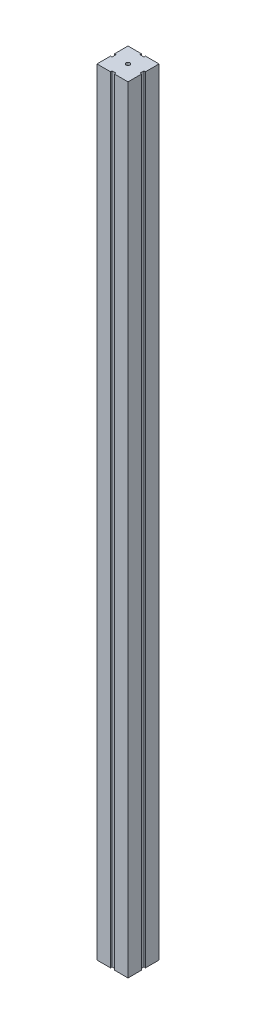
ISO-10303-21;
HEADER;
FILE_DESCRIPTION(('STEP AP214'),'2;1');
FILE_NAME('part.step','',(''),(''),'','','');
FILE_SCHEMA(('AUTOMOTIVE_DESIGN { 1 0 10303 214 1 1 1 1 }'));
ENDSEC;
DATA;
#1=APPLICATION_CONTEXT('core data for automotive mechanical design processes');
#2=APPLICATION_PROTOCOL_DEFINITION('international standard','automotive_design',2000,#1);
#3=PRODUCT_CONTEXT('',#1,'mechanical');
#4=PRODUCT('Part','Part','',(#3));
#5=PRODUCT_RELATED_PRODUCT_CATEGORY('part','',(#4));
#6=PRODUCT_DEFINITION_FORMATION('','',#4);
#7=PRODUCT_DEFINITION_CONTEXT('part definition',#1,'design');
#8=PRODUCT_DEFINITION('design','',#6,#7);
#9=PRODUCT_DEFINITION_SHAPE('','',#8);
#10=(LENGTH_UNIT() NAMED_UNIT(*) SI_UNIT(.MILLI.,.METRE.));
#11=(NAMED_UNIT(*) PLANE_ANGLE_UNIT() SI_UNIT($,.RADIAN.));
#12=(NAMED_UNIT(*) SI_UNIT($,.STERADIAN.) SOLID_ANGLE_UNIT());
#13=UNCERTAINTY_MEASURE_WITH_UNIT(LENGTH_MEASURE(1.E-05),#10,'distance_accuracy_value','');
#14=(GEOMETRIC_REPRESENTATION_CONTEXT(3) GLOBAL_UNCERTAINTY_ASSIGNED_CONTEXT((#13)) GLOBAL_UNIT_ASSIGNED_CONTEXT((#10,
#11,#12)) REPRESENTATION_CONTEXT('',''));
#15=CARTESIAN_POINT('',(0.,0.,0.));
#16=DIRECTION('',(0.,0.,1.));
#17=DIRECTION('',(1.,0.,0.));
#18=AXIS2_PLACEMENT_3D('',#15,#16,#17);
#19=CARTESIAN_POINT('',(0.,1270.,0.));
#20=DIRECTION('',(0.,-1.,0.));
#21=DIRECTION('',(0.,0.,-1.));
#22=AXIS2_PLACEMENT_3D('',#19,#20,#21);
#23=PLANE('',#22);
#24=DIRECTION('',(1.,0.,0.));
#25=VECTOR('',#24,1.);
#26=CARTESIAN_POINT('',(3.17500000000001,1270.,25.4));
#27=LINE('',#26,#25);
#28=CARTESIAN_POINT('',(3.17500000000001,1270.,25.4));
#29=VERTEX_POINT('',#28);
#30=CARTESIAN_POINT('',(25.4,1270.,25.4));
#31=VERTEX_POINT('',#30);
#32=EDGE_CURVE('E272',#29,#31,#27,.T.);
#33=ORIENTED_EDGE('',*,*,#32,.T.);
#34=DIRECTION('',(0.,0.,-1.));
#35=VECTOR('',#34,1.);
#36=CARTESIAN_POINT('',(25.4,1270.,3.175));
#37=LINE('',#36,#35);
#38=CARTESIAN_POINT('',(25.4,1270.,3.175));
#39=VERTEX_POINT('',#38);
#40=EDGE_CURVE('E136',#31,#39,#37,.T.);
#41=ORIENTED_EDGE('',*,*,#40,.T.);
#42=DIRECTION('',(-1.,0.,0.));
#43=VECTOR('',#42,1.);
#44=CARTESIAN_POINT('',(25.4,1270.,3.175));
#45=LINE('',#44,#43);
#46=CARTESIAN_POINT('',(22.8623591334575,1270.,3.17499999999999));
#47=VERTEX_POINT('',#46);
#48=EDGE_CURVE('E341',#39,#47,#45,.T.);
#49=ORIENTED_EDGE('',*,*,#48,.T.);
#50=DIRECTION('',(0.,0.,-1.));
#51=VECTOR('',#50,1.);
#52=CARTESIAN_POINT('',(22.8623591334575,1270.,-3.17500000000001));
#53=LINE('',#52,#51);
#54=CARTESIAN_POINT('',(22.8623591334575,1270.,-3.17500000000001));
#55=VERTEX_POINT('',#54);
#56=EDGE_CURVE('E361',#47,#55,#53,.T.);
#57=ORIENTED_EDGE('',*,*,#56,.T.);
#58=DIRECTION('',(1.,0.,0.));
#59=VECTOR('',#58,1.);
#60=CARTESIAN_POINT('',(25.4,1270.,-3.17500000000001));
#61=LINE('',#60,#59);
#62=CARTESIAN_POINT('',(25.4,1270.,-3.17500000000001));
#63=VERTEX_POINT('',#62);
#64=EDGE_CURVE('E357',#55,#63,#61,.T.);
#65=ORIENTED_EDGE('',*,*,#64,.T.);
#66=DIRECTION('',(0.,0.,-1.));
#67=VECTOR('',#66,1.);
#68=CARTESIAN_POINT('',(25.4,1270.,-25.4));
#69=LINE('',#68,#67);
#70=CARTESIAN_POINT('',(25.4,1270.,-25.4));
#71=VERTEX_POINT('',#70);
#72=EDGE_CURVE('E360',#63,#71,#69,.T.);
#73=ORIENTED_EDGE('',*,*,#72,.T.);
#74=DIRECTION('',(-1.,0.,0.));
#75=VECTOR('',#74,1.);
#76=CARTESIAN_POINT('',(3.17500000000001,1270.,-25.4));
#77=LINE('',#76,#75);
#78=CARTESIAN_POINT('',(3.17500000000001,1270.,-25.4));
#79=VERTEX_POINT('',#78);
#80=EDGE_CURVE('E365',#71,#79,#77,.T.);
#81=ORIENTED_EDGE('',*,*,#80,.T.);
#82=DIRECTION('',(0.,0.,1.));
#83=VECTOR('',#82,1.);
#84=CARTESIAN_POINT('',(3.17500000000001,1270.,-25.4));
#85=LINE('',#84,#83);
#86=CARTESIAN_POINT('',(3.175,1270.,-22.8623591334575));
#87=VERTEX_POINT('',#86);
#88=EDGE_CURVE('E372',#79,#87,#85,.T.);
#89=ORIENTED_EDGE('',*,*,#88,.T.);
#90=DIRECTION('',(-1.,0.,0.));
#91=VECTOR('',#90,1.);
#92=CARTESIAN_POINT('',(-3.175,1270.,-22.8623591334575));
#93=LINE('',#92,#91);
#94=CARTESIAN_POINT('',(-3.175,1270.,-22.8623591334575));
#95=VERTEX_POINT('',#94);
#96=EDGE_CURVE('E375',#87,#95,#93,.T.);
#97=ORIENTED_EDGE('',*,*,#96,.T.);
#98=DIRECTION('',(0.,0.,-1.));
#99=VECTOR('',#98,1.);
#100=CARTESIAN_POINT('',(-3.175,1270.,-25.4));
#101=LINE('',#100,#99);
#102=CARTESIAN_POINT('',(-3.175,1270.,-25.4));
#103=VERTEX_POINT('',#102);
#104=EDGE_CURVE('E378',#95,#103,#101,.T.);
#105=ORIENTED_EDGE('',*,*,#104,.T.);
#106=DIRECTION('',(-1.,0.,0.));
#107=VECTOR('',#106,1.);
#108=CARTESIAN_POINT('',(-25.4,1270.,-25.4));
#109=LINE('',#108,#107);
#110=CARTESIAN_POINT('',(-25.4,1270.,-25.4));
#111=VERTEX_POINT('',#110);
#112=EDGE_CURVE('E381',#103,#111,#109,.T.);
#113=ORIENTED_EDGE('',*,*,#112,.T.);
#114=DIRECTION('',(0.,0.,1.));
#115=VECTOR('',#114,1.);
#116=CARTESIAN_POINT('',(-25.4,1270.,-25.4));
#117=LINE('',#116,#115);
#118=CARTESIAN_POINT('',(-25.4,1270.,-3.175));
#119=VERTEX_POINT('',#118);
#120=EDGE_CURVE('E384',#111,#119,#117,.T.);
#121=ORIENTED_EDGE('',*,*,#120,.T.);
#122=DIRECTION('',(1.,0.,0.));
#123=VECTOR('',#122,1.);
#124=CARTESIAN_POINT('',(-25.4,1270.,-3.175));
#125=LINE('',#124,#123);
#126=CARTESIAN_POINT('',(-22.8623591334575,1270.,-3.17499999999999));
#127=VERTEX_POINT('',#126);
#128=EDGE_CURVE('E387',#119,#127,#125,.T.);
#129=ORIENTED_EDGE('',*,*,#128,.T.);
#130=DIRECTION('',(0.,0.,1.));
#131=VECTOR('',#130,1.);
#132=CARTESIAN_POINT('',(-22.8623591334575,1270.,3.17500000000001));
#133=LINE('',#132,#131);
#134=CARTESIAN_POINT('',(-22.8623591334575,1270.,3.17500000000001));
#135=VERTEX_POINT('',#134);
#136=EDGE_CURVE('E390',#127,#135,#133,.T.);
#137=ORIENTED_EDGE('',*,*,#136,.T.);
#138=DIRECTION('',(-1.,0.,0.));
#139=VECTOR('',#138,1.);
#140=CARTESIAN_POINT('',(-25.4,1270.,3.17500000000001));
#141=LINE('',#140,#139);
#142=CARTESIAN_POINT('',(-25.4,1270.,3.17500000000001));
#143=VERTEX_POINT('',#142);
#144=EDGE_CURVE('E393',#135,#143,#141,.T.);
#145=ORIENTED_EDGE('',*,*,#144,.T.);
#146=DIRECTION('',(0.,0.,1.));
#147=VECTOR('',#146,1.);
#148=CARTESIAN_POINT('',(-25.4,1270.,3.17500000000001));
#149=LINE('',#148,#147);
#150=CARTESIAN_POINT('',(-25.4,1270.,25.4));
#151=VERTEX_POINT('',#150);
#152=EDGE_CURVE('E396',#143,#151,#149,.T.);
#153=ORIENTED_EDGE('',*,*,#152,.T.);
#154=DIRECTION('',(1.,0.,0.));
#155=VECTOR('',#154,1.);
#156=CARTESIAN_POINT('',(-25.4,1270.,25.4));
#157=LINE('',#156,#155);
#158=CARTESIAN_POINT('',(-3.175,1270.,25.4));
#159=VERTEX_POINT('',#158);
#160=EDGE_CURVE('E191',#151,#159,#157,.T.);
#161=ORIENTED_EDGE('',*,*,#160,.T.);
#162=DIRECTION('',(0.,0.,-1.));
#163=VECTOR('',#162,1.);
#164=CARTESIAN_POINT('',(-3.175,1270.,25.4));
#165=LINE('',#164,#163);
#166=CARTESIAN_POINT('',(-3.17499999999999,1270.,22.8623591334575));
#167=VERTEX_POINT('',#166);
#168=EDGE_CURVE('E185',#159,#167,#165,.T.);
#169=ORIENTED_EDGE('',*,*,#168,.T.);
#170=DIRECTION('',(1.,0.,0.));
#171=VECTOR('',#170,1.);
#172=CARTESIAN_POINT('',(3.17500000000001,1270.,22.8623591334575));
#173=LINE('',#172,#171);
#174=CARTESIAN_POINT('',(3.17500000000001,1270.,22.8623591334575));
#175=VERTEX_POINT('',#174);
#176=EDGE_CURVE('E189',#167,#175,#173,.T.);
#177=ORIENTED_EDGE('',*,*,#176,.T.);
#178=DIRECTION('',(0.,0.,1.));
#179=VECTOR('',#178,1.);
#180=CARTESIAN_POINT('',(3.17500000000001,1270.,25.4));
#181=LINE('',#180,#179);
#182=EDGE_CURVE('E57',#175,#29,#181,.T.);
#183=ORIENTED_EDGE('',*,*,#182,.T.);
#184=EDGE_LOOP('',(#33,#41,#49,#57,#65,#73,#81,#89,#97,#105,#113,#121,#129,#137,#145,#153,#161,
#169,#177,#183));
#185=FACE_BOUND('',#184,.T.);
#186=CARTESIAN_POINT('',(0.,1270.,0.));
#187=DIRECTION('',(0.,1.,0.));
#188=DIRECTION('',(0.,0.,1.));
#189=AXIS2_PLACEMENT_3D('',#186,#187,#188);
#190=CIRCLE('',#189,3.175);
#191=CARTESIAN_POINT('',(0.,1270.,-3.175));
#192=VERTEX_POINT('',#191);
#193=EDGE_CURVE('E218',#192,#192,#190,.T.);
#194=ORIENTED_EDGE('',*,*,#193,.F.);
#195=EDGE_LOOP('',(#194));
#196=FACE_BOUND('',#195,.T.);
#197=ADVANCED_FACE('F39',(#185,#196),#23,.F.);
#198=CARTESIAN_POINT('',(0.,0.,0.));
#199=DIRECTION('',(0.,-1.,0.));
#200=DIRECTION('',(0.,0.,-1.));
#201=AXIS2_PLACEMENT_3D('',#198,#199,#200);
#202=PLANE('',#201);
#203=DIRECTION('',(1.,0.,0.));
#204=VECTOR('',#203,1.);
#205=CARTESIAN_POINT('',(3.17500000000001,0.,25.4));
#206=LINE('',#205,#204);
#207=CARTESIAN_POINT('',(3.17500000000001,0.,25.4));
#208=VERTEX_POINT('',#207);
#209=CARTESIAN_POINT('',(25.4,0.,25.4));
#210=VERTEX_POINT('',#209);
#211=EDGE_CURVE('E213',#208,#210,#206,.T.);
#212=ORIENTED_EDGE('',*,*,#211,.F.);
#213=DIRECTION('',(0.,0.,1.));
#214=VECTOR('',#213,1.);
#215=CARTESIAN_POINT('',(3.17500000000001,0.,25.4));
#216=LINE('',#215,#214);
#217=CARTESIAN_POINT('',(3.17500000000001,0.,22.8623591334575));
#218=VERTEX_POINT('',#217);
#219=EDGE_CURVE('E128',#218,#208,#216,.T.);
#220=ORIENTED_EDGE('',*,*,#219,.F.);
#221=DIRECTION('',(1.,0.,0.));
#222=VECTOR('',#221,1.);
#223=CARTESIAN_POINT('',(3.17500000000001,0.,22.8623591334575));
#224=LINE('',#223,#222);
#225=CARTESIAN_POINT('',(-3.17499999999999,0.,22.8623591334575));
#226=VERTEX_POINT('',#225);
#227=EDGE_CURVE('E122',#226,#218,#224,.T.);
#228=ORIENTED_EDGE('',*,*,#227,.F.);
#229=DIRECTION('',(0.,0.,-1.));
#230=VECTOR('',#229,1.);
#231=CARTESIAN_POINT('',(-3.175,0.,25.4));
#232=LINE('',#231,#230);
#233=CARTESIAN_POINT('',(-3.175,0.,25.4));
#234=VERTEX_POINT('',#233);
#235=EDGE_CURVE('E200',#234,#226,#232,.T.);
#236=ORIENTED_EDGE('',*,*,#235,.F.);
#237=DIRECTION('',(1.,0.,0.));
#238=VECTOR('',#237,1.);
#239=CARTESIAN_POINT('',(-25.4,0.,25.4));
#240=LINE('',#239,#238);
#241=CARTESIAN_POINT('',(-25.4,0.,25.4));
#242=VERTEX_POINT('',#241);
#243=EDGE_CURVE('E263',#242,#234,#240,.T.);
#244=ORIENTED_EDGE('',*,*,#243,.F.);
#245=DIRECTION('',(0.,0.,1.));
#246=VECTOR('',#245,1.);
#247=CARTESIAN_POINT('',(-25.4,0.,3.17500000000001));
#248=LINE('',#247,#246);
#249=CARTESIAN_POINT('',(-25.4,0.,3.17500000000001));
#250=VERTEX_POINT('',#249);
#251=EDGE_CURVE('E260',#250,#242,#248,.T.);
#252=ORIENTED_EDGE('',*,*,#251,.F.);
#253=DIRECTION('',(-1.,0.,0.));
#254=VECTOR('',#253,1.);
#255=CARTESIAN_POINT('',(-25.4,0.,3.17500000000001));
#256=LINE('',#255,#254);
#257=CARTESIAN_POINT('',(-22.8623591334575,0.,3.17500000000001));
#258=VERTEX_POINT('',#257);
#259=EDGE_CURVE('E257',#258,#250,#256,.T.);
#260=ORIENTED_EDGE('',*,*,#259,.F.);
#261=DIRECTION('',(0.,0.,1.));
#262=VECTOR('',#261,1.);
#263=CARTESIAN_POINT('',(-22.8623591334575,0.,3.17500000000001));
#264=LINE('',#263,#262);
#265=CARTESIAN_POINT('',(-22.8623591334575,0.,-3.17499999999999));
#266=VERTEX_POINT('',#265);
#267=EDGE_CURVE('E254',#266,#258,#264,.T.);
#268=ORIENTED_EDGE('',*,*,#267,.F.);
#269=DIRECTION('',(1.,0.,0.));
#270=VECTOR('',#269,1.);
#271=CARTESIAN_POINT('',(-25.4,0.,-3.175));
#272=LINE('',#271,#270);
#273=CARTESIAN_POINT('',(-25.4,0.,-3.175));
#274=VERTEX_POINT('',#273);
#275=EDGE_CURVE('E251',#274,#266,#272,.T.);
#276=ORIENTED_EDGE('',*,*,#275,.F.);
#277=DIRECTION('',(0.,0.,1.));
#278=VECTOR('',#277,1.);
#279=CARTESIAN_POINT('',(-25.4,0.,-25.4));
#280=LINE('',#279,#278);
#281=CARTESIAN_POINT('',(-25.4,0.,-25.4));
#282=VERTEX_POINT('',#281);
#283=EDGE_CURVE('E248',#282,#274,#280,.T.);
#284=ORIENTED_EDGE('',*,*,#283,.F.);
#285=DIRECTION('',(-1.,0.,0.));
#286=VECTOR('',#285,1.);
#287=CARTESIAN_POINT('',(-25.4,0.,-25.4));
#288=LINE('',#287,#286);
#289=CARTESIAN_POINT('',(-3.175,0.,-25.4));
#290=VERTEX_POINT('',#289);
#291=EDGE_CURVE('E245',#290,#282,#288,.T.);
#292=ORIENTED_EDGE('',*,*,#291,.F.);
#293=DIRECTION('',(0.,0.,-1.));
#294=VECTOR('',#293,1.);
#295=CARTESIAN_POINT('',(-3.175,0.,-25.4));
#296=LINE('',#295,#294);
#297=CARTESIAN_POINT('',(-3.175,0.,-22.8623591334575));
#298=VERTEX_POINT('',#297);
#299=EDGE_CURVE('E242',#298,#290,#296,.T.);
#300=ORIENTED_EDGE('',*,*,#299,.F.);
#301=DIRECTION('',(-1.,0.,0.));
#302=VECTOR('',#301,1.);
#303=CARTESIAN_POINT('',(-3.175,0.,-22.8623591334575));
#304=LINE('',#303,#302);
#305=CARTESIAN_POINT('',(3.175,0.,-22.8623591334575));
#306=VERTEX_POINT('',#305);
#307=EDGE_CURVE('E239',#306,#298,#304,.T.);
#308=ORIENTED_EDGE('',*,*,#307,.F.);
#309=DIRECTION('',(0.,0.,1.));
#310=VECTOR('',#309,1.);
#311=CARTESIAN_POINT('',(3.17500000000001,0.,-25.4));
#312=LINE('',#311,#310);
#313=CARTESIAN_POINT('',(3.17500000000001,0.,-25.4));
#314=VERTEX_POINT('',#313);
#315=EDGE_CURVE('E236',#314,#306,#312,.T.);
#316=ORIENTED_EDGE('',*,*,#315,.F.);
#317=DIRECTION('',(-1.,0.,0.));
#318=VECTOR('',#317,1.);
#319=CARTESIAN_POINT('',(3.17500000000001,0.,-25.4));
#320=LINE('',#319,#318);
#321=CARTESIAN_POINT('',(25.4,0.,-25.4));
#322=VERTEX_POINT('',#321);
#323=EDGE_CURVE('E233',#322,#314,#320,.T.);
#324=ORIENTED_EDGE('',*,*,#323,.F.);
#325=DIRECTION('',(0.,0.,-1.));
#326=VECTOR('',#325,1.);
#327=CARTESIAN_POINT('',(25.4,0.,-25.4));
#328=LINE('',#327,#326);
#329=CARTESIAN_POINT('',(25.4,0.,-3.17500000000001));
#330=VERTEX_POINT('',#329);
#331=EDGE_CURVE('E230',#330,#322,#328,.T.);
#332=ORIENTED_EDGE('',*,*,#331,.F.);
#333=DIRECTION('',(1.,0.,0.));
#334=VECTOR('',#333,1.);
#335=CARTESIAN_POINT('',(25.4,0.,-3.17500000000001));
#336=LINE('',#335,#334);
#337=CARTESIAN_POINT('',(22.8623591334575,0.,-3.17500000000001));
#338=VERTEX_POINT('',#337);
#339=EDGE_CURVE('E227',#338,#330,#336,.T.);
#340=ORIENTED_EDGE('',*,*,#339,.F.);
#341=DIRECTION('',(0.,0.,-1.));
#342=VECTOR('',#341,1.);
#343=CARTESIAN_POINT('',(22.8623591334575,0.,-3.17500000000001));
#344=LINE('',#343,#342);
#345=CARTESIAN_POINT('',(22.8623591334575,0.,3.17499999999999));
#346=VERTEX_POINT('',#345);
#347=EDGE_CURVE('E224',#346,#338,#344,.T.);
#348=ORIENTED_EDGE('',*,*,#347,.F.);
#349=DIRECTION('',(-1.,0.,0.));
#350=VECTOR('',#349,1.);
#351=CARTESIAN_POINT('',(25.4,0.,3.175));
#352=LINE('',#351,#350);
#353=CARTESIAN_POINT('',(25.4,0.,3.175));
#354=VERTEX_POINT('',#353);
#355=EDGE_CURVE('E221',#354,#346,#352,.T.);
#356=ORIENTED_EDGE('',*,*,#355,.F.);
#357=DIRECTION('',(0.,0.,-1.));
#358=VECTOR('',#357,1.);
#359=CARTESIAN_POINT('',(25.4,0.,3.175));
#360=LINE('',#359,#358);
#361=EDGE_CURVE('E217',#210,#354,#360,.T.);
#362=ORIENTED_EDGE('',*,*,#361,.F.);
#363=EDGE_LOOP('',(#212,#220,#228,#236,#244,#252,#260,#268,#276,#284,#292,#300,#308,#316,#324,
#332,#340,#348,#356,#362));
#364=FACE_BOUND('',#363,.T.);
#365=CARTESIAN_POINT('',(0.,0.,0.));
#366=DIRECTION('',(0.,1.,0.));
#367=DIRECTION('',(0.,0.,1.));
#368=AXIS2_PLACEMENT_3D('',#365,#366,#367);
#369=CIRCLE('',#368,3.175);
#370=CARTESIAN_POINT('',(0.,-2.22044604925031E-13,-3.175));
#371=VERTEX_POINT('',#370);
#372=EDGE_CURVE('E649',#371,#371,#369,.T.);
#373=ORIENTED_EDGE('',*,*,#372,.T.);
#374=EDGE_LOOP('',(#373));
#375=FACE_BOUND('',#374,.T.);
#376=ADVANCED_FACE('F345',(#364,#375),#202,.T.);
#377=CARTESIAN_POINT('',(3.17500000000001,1270.,25.4));
#378=DIRECTION('',(0.,0.,-1.));
#379=DIRECTION('',(-1.,0.,0.));
#380=AXIS2_PLACEMENT_3D('',#377,#378,#379);
#381=PLANE('',#380);
#382=ORIENTED_EDGE('',*,*,#211,.T.);
#383=DIRECTION('',(0.,-1.,0.));
#384=VECTOR('',#383,1.);
#385=CARTESIAN_POINT('',(25.4,1270.,25.4));
#386=LINE('',#385,#384);
#387=EDGE_CURVE('E11',#31,#210,#386,.T.);
#388=ORIENTED_EDGE('',*,*,#387,.F.);
#389=ORIENTED_EDGE('',*,*,#32,.F.);
#390=DIRECTION('',(0.,-1.,0.));
#391=VECTOR('',#390,1.);
#392=CARTESIAN_POINT('',(3.17500000000001,1270.,25.4));
#393=LINE('',#392,#391);
#394=EDGE_CURVE('E209',#29,#208,#393,.T.);
#395=ORIENTED_EDGE('',*,*,#394,.T.);
#396=EDGE_LOOP('',(#382,#388,#389,#395));
#397=FACE_BOUND('',#396,.T.);
#398=ADVANCED_FACE('F41',(#397),#381,.F.);
#399=CARTESIAN_POINT('',(25.4,1270.,3.175));
#400=DIRECTION('',(-1.,0.,0.));
#401=DIRECTION('',(0.,0.,1.));
#402=AXIS2_PLACEMENT_3D('',#399,#400,#401);
#403=PLANE('',#402);
#404=ORIENTED_EDGE('',*,*,#361,.T.);
#405=DIRECTION('',(0.,-1.,0.));
#406=VECTOR('',#405,1.);
#407=CARTESIAN_POINT('',(25.4,1270.,3.175));
#408=LINE('',#407,#406);
#409=EDGE_CURVE('E49',#39,#354,#408,.T.);
#410=ORIENTED_EDGE('',*,*,#409,.F.);
#411=ORIENTED_EDGE('',*,*,#40,.F.);
#412=ORIENTED_EDGE('',*,*,#387,.T.);
#413=EDGE_LOOP('',(#404,#410,#411,#412));
#414=FACE_BOUND('',#413,.T.);
#415=ADVANCED_FACE('F432',(#414),#403,.F.);
#416=CARTESIAN_POINT('',(25.4,1270.,3.175));
#417=DIRECTION('',(0.,0.,1.));
#418=DIRECTION('',(1.,0.,0.));
#419=AXIS2_PLACEMENT_3D('',#416,#417,#418);
#420=PLANE('',#419);
#421=ORIENTED_EDGE('',*,*,#355,.T.);
#422=DIRECTION('',(0.,-1.,0.));
#423=VECTOR('',#422,1.);
#424=CARTESIAN_POINT('',(22.8623591334575,1270.,3.17499999999999));
#425=LINE('',#424,#423);
#426=EDGE_CURVE('E331',#47,#346,#425,.T.);
#427=ORIENTED_EDGE('',*,*,#426,.F.);
#428=ORIENTED_EDGE('',*,*,#48,.F.);
#429=ORIENTED_EDGE('',*,*,#409,.T.);
#430=EDGE_LOOP('',(#421,#427,#428,#429));
#431=FACE_BOUND('',#430,.T.);
#432=ADVANCED_FACE('F339',(#431),#420,.F.);
#433=CARTESIAN_POINT('',(22.8623591334575,1270.,-3.17500000000001));
#434=DIRECTION('',(-1.,0.,0.));
#435=DIRECTION('',(0.,0.,1.));
#436=AXIS2_PLACEMENT_3D('',#433,#434,#435);
#437=PLANE('',#436);
#438=ORIENTED_EDGE('',*,*,#347,.T.);
#439=DIRECTION('',(0.,-1.,0.));
#440=VECTOR('',#439,1.);
#441=CARTESIAN_POINT('',(22.8623591334575,1270.,-3.17500000000001));
#442=LINE('',#441,#440);
#443=EDGE_CURVE('E327',#55,#338,#442,.T.);
#444=ORIENTED_EDGE('',*,*,#443,.F.);
#445=ORIENTED_EDGE('',*,*,#56,.F.);
#446=ORIENTED_EDGE('',*,*,#426,.T.);
#447=EDGE_LOOP('',(#438,#444,#445,#446));
#448=FACE_BOUND('',#447,.T.);
#449=ADVANCED_FACE('F351',(#448),#437,.F.);
#450=CARTESIAN_POINT('',(25.4,1270.,-3.17500000000001));
#451=DIRECTION('',(0.,0.,-1.));
#452=DIRECTION('',(-1.,0.,0.));
#453=AXIS2_PLACEMENT_3D('',#450,#451,#452);
#454=PLANE('',#453);
#455=ORIENTED_EDGE('',*,*,#339,.T.);
#456=DIRECTION('',(0.,-1.,0.));
#457=VECTOR('',#456,1.);
#458=CARTESIAN_POINT('',(25.4,1270.,-3.17500000000001));
#459=LINE('',#458,#457);
#460=EDGE_CURVE('E323',#63,#330,#459,.T.);
#461=ORIENTED_EDGE('',*,*,#460,.F.);
#462=ORIENTED_EDGE('',*,*,#64,.F.);
#463=ORIENTED_EDGE('',*,*,#443,.T.);
#464=EDGE_LOOP('',(#455,#461,#462,#463));
#465=FACE_BOUND('',#464,.T.);
#466=ADVANCED_FACE('F355',(#465),#454,.F.);
#467=CARTESIAN_POINT('',(25.4,1270.,-25.4));
#468=DIRECTION('',(-1.,0.,0.));
#469=DIRECTION('',(0.,0.,1.));
#470=AXIS2_PLACEMENT_3D('',#467,#468,#469);
#471=PLANE('',#470);
#472=ORIENTED_EDGE('',*,*,#331,.T.);
#473=DIRECTION('',(0.,-1.,0.));
#474=VECTOR('',#473,1.);
#475=CARTESIAN_POINT('',(25.4,1270.,-25.4));
#476=LINE('',#475,#474);
#477=EDGE_CURVE('E319',#71,#322,#476,.T.);
#478=ORIENTED_EDGE('',*,*,#477,.F.);
#479=ORIENTED_EDGE('',*,*,#72,.F.);
#480=ORIENTED_EDGE('',*,*,#460,.T.);
#481=EDGE_LOOP('',(#472,#478,#479,#480));
#482=FACE_BOUND('',#481,.T.);
#483=ADVANCED_FACE('F445',(#482),#471,.F.);
#484=CARTESIAN_POINT('',(3.17500000000001,1270.,-25.4));
#485=DIRECTION('',(0.,0.,1.));
#486=DIRECTION('',(1.,0.,0.));
#487=AXIS2_PLACEMENT_3D('',#484,#485,#486);
#488=PLANE('',#487);
#489=ORIENTED_EDGE('',*,*,#323,.T.);
#490=DIRECTION('',(0.,-1.,0.));
#491=VECTOR('',#490,1.);
#492=CARTESIAN_POINT('',(3.17500000000001,1270.,-25.4));
#493=LINE('',#492,#491);
#494=EDGE_CURVE('E315',#79,#314,#493,.T.);
#495=ORIENTED_EDGE('',*,*,#494,.F.);
#496=ORIENTED_EDGE('',*,*,#80,.F.);
#497=ORIENTED_EDGE('',*,*,#477,.T.);
#498=EDGE_LOOP('',(#489,#495,#496,#497));
#499=FACE_BOUND('',#498,.T.);
#500=ADVANCED_FACE('F448',(#499),#488,.F.);
#501=CARTESIAN_POINT('',(3.17500000000001,1270.,-25.4));
#502=DIRECTION('',(1.,0.,0.));
#503=DIRECTION('',(0.,0.,-1.));
#504=AXIS2_PLACEMENT_3D('',#501,#502,#503);
#505=PLANE('',#504);
#506=ORIENTED_EDGE('',*,*,#315,.T.);
#507=DIRECTION('',(0.,-1.,0.));
#508=VECTOR('',#507,1.);
#509=CARTESIAN_POINT('',(3.175,1270.,-22.8623591334575));
#510=LINE('',#509,#508);
#511=EDGE_CURVE('E311',#87,#306,#510,.T.);
#512=ORIENTED_EDGE('',*,*,#511,.F.);
#513=ORIENTED_EDGE('',*,*,#88,.F.);
#514=ORIENTED_EDGE('',*,*,#494,.T.);
#515=EDGE_LOOP('',(#506,#512,#513,#514));
#516=FACE_BOUND('',#515,.T.);
#517=ADVANCED_FACE('F452',(#516),#505,.F.);
#518=CARTESIAN_POINT('',(-3.175,1270.,-22.8623591334575));
#519=DIRECTION('',(0.,0.,1.));
#520=DIRECTION('',(1.,0.,0.));
#521=AXIS2_PLACEMENT_3D('',#518,#519,#520);
#522=PLANE('',#521);
#523=ORIENTED_EDGE('',*,*,#307,.T.);
#524=DIRECTION('',(0.,-1.,0.));
#525=VECTOR('',#524,1.);
#526=CARTESIAN_POINT('',(-3.175,1270.,-22.8623591334575));
#527=LINE('',#526,#525);
#528=EDGE_CURVE('E307',#95,#298,#527,.T.);
#529=ORIENTED_EDGE('',*,*,#528,.F.);
#530=ORIENTED_EDGE('',*,*,#96,.F.);
#531=ORIENTED_EDGE('',*,*,#511,.T.);
#532=EDGE_LOOP('',(#523,#529,#530,#531));
#533=FACE_BOUND('',#532,.T.);
#534=ADVANCED_FACE('F456',(#533),#522,.F.);
#535=CARTESIAN_POINT('',(-3.175,1270.,-25.4));
#536=DIRECTION('',(-1.,0.,0.));
#537=DIRECTION('',(0.,0.,1.));
#538=AXIS2_PLACEMENT_3D('',#535,#536,#537);
#539=PLANE('',#538);
#540=ORIENTED_EDGE('',*,*,#299,.T.);
#541=DIRECTION('',(0.,-1.,0.));
#542=VECTOR('',#541,1.);
#543=CARTESIAN_POINT('',(-3.175,1270.,-25.4));
#544=LINE('',#543,#542);
#545=EDGE_CURVE('E303',#103,#290,#544,.T.);
#546=ORIENTED_EDGE('',*,*,#545,.F.);
#547=ORIENTED_EDGE('',*,*,#104,.F.);
#548=ORIENTED_EDGE('',*,*,#528,.T.);
#549=EDGE_LOOP('',(#540,#546,#547,#548));
#550=FACE_BOUND('',#549,.T.);
#551=ADVANCED_FACE('F460',(#550),#539,.F.);
#552=CARTESIAN_POINT('',(-25.4,1270.,-25.4));
#553=DIRECTION('',(0.,0.,1.));
#554=DIRECTION('',(1.,0.,0.));
#555=AXIS2_PLACEMENT_3D('',#552,#553,#554);
#556=PLANE('',#555);
#557=ORIENTED_EDGE('',*,*,#291,.T.);
#558=DIRECTION('',(0.,-1.,0.));
#559=VECTOR('',#558,1.);
#560=CARTESIAN_POINT('',(-25.4,1270.,-25.4));
#561=LINE('',#560,#559);
#562=EDGE_CURVE('E299',#111,#282,#561,.T.);
#563=ORIENTED_EDGE('',*,*,#562,.F.);
#564=ORIENTED_EDGE('',*,*,#112,.F.);
#565=ORIENTED_EDGE('',*,*,#545,.T.);
#566=EDGE_LOOP('',(#557,#563,#564,#565));
#567=FACE_BOUND('',#566,.T.);
#568=ADVANCED_FACE('F464',(#567),#556,.F.);
#569=CARTESIAN_POINT('',(-25.4,1270.,-25.4));
#570=DIRECTION('',(1.,0.,0.));
#571=DIRECTION('',(0.,0.,-1.));
#572=AXIS2_PLACEMENT_3D('',#569,#570,#571);
#573=PLANE('',#572);
#574=ORIENTED_EDGE('',*,*,#283,.T.);
#575=DIRECTION('',(0.,-1.,0.));
#576=VECTOR('',#575,1.);
#577=CARTESIAN_POINT('',(-25.4,1270.,-3.175));
#578=LINE('',#577,#576);
#579=EDGE_CURVE('E295',#119,#274,#578,.T.);
#580=ORIENTED_EDGE('',*,*,#579,.F.);
#581=ORIENTED_EDGE('',*,*,#120,.F.);
#582=ORIENTED_EDGE('',*,*,#562,.T.);
#583=EDGE_LOOP('',(#574,#580,#581,#582));
#584=FACE_BOUND('',#583,.T.);
#585=ADVANCED_FACE('F468',(#584),#573,.F.);
#586=CARTESIAN_POINT('',(-25.4,1270.,-3.175));
#587=DIRECTION('',(0.,0.,-1.));
#588=DIRECTION('',(-1.,0.,0.));
#589=AXIS2_PLACEMENT_3D('',#586,#587,#588);
#590=PLANE('',#589);
#591=ORIENTED_EDGE('',*,*,#275,.T.);
#592=DIRECTION('',(0.,-1.,0.));
#593=VECTOR('',#592,1.);
#594=CARTESIAN_POINT('',(-22.8623591334575,1270.,-3.17499999999999));
#595=LINE('',#594,#593);
#596=EDGE_CURVE('E291',#127,#266,#595,.T.);
#597=ORIENTED_EDGE('',*,*,#596,.F.);
#598=ORIENTED_EDGE('',*,*,#128,.F.);
#599=ORIENTED_EDGE('',*,*,#579,.T.);
#600=EDGE_LOOP('',(#591,#597,#598,#599));
#601=FACE_BOUND('',#600,.T.);
#602=ADVANCED_FACE('F472',(#601),#590,.F.);
#603=CARTESIAN_POINT('',(-22.8623591334575,1270.,3.17500000000001));
#604=DIRECTION('',(1.,0.,0.));
#605=DIRECTION('',(0.,0.,-1.));
#606=AXIS2_PLACEMENT_3D('',#603,#604,#605);
#607=PLANE('',#606);
#608=ORIENTED_EDGE('',*,*,#267,.T.);
#609=DIRECTION('',(0.,-1.,0.));
#610=VECTOR('',#609,1.);
#611=CARTESIAN_POINT('',(-22.8623591334575,1270.,3.17500000000001));
#612=LINE('',#611,#610);
#613=EDGE_CURVE('E287',#135,#258,#612,.T.);
#614=ORIENTED_EDGE('',*,*,#613,.F.);
#615=ORIENTED_EDGE('',*,*,#136,.F.);
#616=ORIENTED_EDGE('',*,*,#596,.T.);
#617=EDGE_LOOP('',(#608,#614,#615,#616));
#618=FACE_BOUND('',#617,.T.);
#619=ADVANCED_FACE('F476',(#618),#607,.F.);
#620=CARTESIAN_POINT('',(-25.4,1270.,3.17500000000001));
#621=DIRECTION('',(0.,0.,1.));
#622=DIRECTION('',(1.,0.,0.));
#623=AXIS2_PLACEMENT_3D('',#620,#621,#622);
#624=PLANE('',#623);
#625=ORIENTED_EDGE('',*,*,#259,.T.);
#626=DIRECTION('',(0.,-1.,0.));
#627=VECTOR('',#626,1.);
#628=CARTESIAN_POINT('',(-25.4,1270.,3.17500000000001));
#629=LINE('',#628,#627);
#630=EDGE_CURVE('E283',#143,#250,#629,.T.);
#631=ORIENTED_EDGE('',*,*,#630,.F.);
#632=ORIENTED_EDGE('',*,*,#144,.F.);
#633=ORIENTED_EDGE('',*,*,#613,.T.);
#634=EDGE_LOOP('',(#625,#631,#632,#633));
#635=FACE_BOUND('',#634,.T.);
#636=ADVANCED_FACE('F480',(#635),#624,.F.);
#637=CARTESIAN_POINT('',(-25.4,1270.,3.17500000000001));
#638=DIRECTION('',(1.,0.,0.));
#639=DIRECTION('',(0.,0.,-1.));
#640=AXIS2_PLACEMENT_3D('',#637,#638,#639);
#641=PLANE('',#640);
#642=ORIENTED_EDGE('',*,*,#251,.T.);
#643=DIRECTION('',(0.,-1.,0.));
#644=VECTOR('',#643,1.);
#645=CARTESIAN_POINT('',(-25.4,1270.,25.4));
#646=LINE('',#645,#644);
#647=EDGE_CURVE('E279',#151,#242,#646,.T.);
#648=ORIENTED_EDGE('',*,*,#647,.F.);
#649=ORIENTED_EDGE('',*,*,#152,.F.);
#650=ORIENTED_EDGE('',*,*,#630,.T.);
#651=EDGE_LOOP('',(#642,#648,#649,#650));
#652=FACE_BOUND('',#651,.T.);
#653=ADVANCED_FACE('F404',(#652),#641,.F.);
#654=CARTESIAN_POINT('',(-25.4,1270.,25.4));
#655=DIRECTION('',(0.,0.,-1.));
#656=DIRECTION('',(-1.,0.,0.));
#657=AXIS2_PLACEMENT_3D('',#654,#655,#656);
#658=PLANE('',#657);
#659=ORIENTED_EDGE('',*,*,#243,.T.);
#660=DIRECTION('',(0.,-1.,0.));
#661=VECTOR('',#660,1.);
#662=CARTESIAN_POINT('',(-3.175,1270.,25.4));
#663=LINE('',#662,#661);
#664=EDGE_CURVE('E202',#159,#234,#663,.T.);
#665=ORIENTED_EDGE('',*,*,#664,.F.);
#666=ORIENTED_EDGE('',*,*,#160,.F.);
#667=ORIENTED_EDGE('',*,*,#647,.T.);
#668=EDGE_LOOP('',(#659,#665,#666,#667));
#669=FACE_BOUND('',#668,.T.);
#670=ADVANCED_FACE('F408',(#669),#658,.F.);
#671=CARTESIAN_POINT('',(-3.175,1270.,25.4));
#672=DIRECTION('',(-1.,0.,0.));
#673=DIRECTION('',(0.,0.,1.));
#674=AXIS2_PLACEMENT_3D('',#671,#672,#673);
#675=PLANE('',#674);
#676=ORIENTED_EDGE('',*,*,#235,.T.);
#677=DIRECTION('',(0.,-1.,0.));
#678=VECTOR('',#677,1.);
#679=CARTESIAN_POINT('',(-3.17499999999999,1270.,22.8623591334575));
#680=LINE('',#679,#678);
#681=EDGE_CURVE('E197',#167,#226,#680,.T.);
#682=ORIENTED_EDGE('',*,*,#681,.F.);
#683=ORIENTED_EDGE('',*,*,#168,.F.);
#684=ORIENTED_EDGE('',*,*,#664,.T.);
#685=EDGE_LOOP('',(#676,#682,#683,#684));
#686=FACE_BOUND('',#685,.T.);
#687=ADVANCED_FACE('F198',(#686),#675,.F.);
#688=CARTESIAN_POINT('',(3.17500000000001,1270.,22.8623591334575));
#689=DIRECTION('',(0.,0.,-1.));
#690=DIRECTION('',(-1.,0.,0.));
#691=AXIS2_PLACEMENT_3D('',#688,#689,#690);
#692=PLANE('',#691);
#693=ORIENTED_EDGE('',*,*,#227,.T.);
#694=DIRECTION('',(0.,-1.,0.));
#695=VECTOR('',#694,1.);
#696=CARTESIAN_POINT('',(3.17500000000001,1270.,22.8623591334575));
#697=LINE('',#696,#695);
#698=EDGE_CURVE('E203',#175,#218,#697,.T.);
#699=ORIENTED_EDGE('',*,*,#698,.F.);
#700=ORIENTED_EDGE('',*,*,#176,.F.);
#701=ORIENTED_EDGE('',*,*,#681,.T.);
#702=EDGE_LOOP('',(#693,#699,#700,#701));
#703=FACE_BOUND('',#702,.T.);
#704=ADVANCED_FACE('F205',(#703),#692,.F.);
#705=CARTESIAN_POINT('',(3.17500000000001,1270.,25.4));
#706=DIRECTION('',(1.,0.,0.));
#707=DIRECTION('',(0.,0.,-1.));
#708=AXIS2_PLACEMENT_3D('',#705,#706,#707);
#709=PLANE('',#708);
#710=ORIENTED_EDGE('',*,*,#219,.T.);
#711=ORIENTED_EDGE('',*,*,#394,.F.);
#712=ORIENTED_EDGE('',*,*,#182,.F.);
#713=ORIENTED_EDGE('',*,*,#698,.T.);
#714=EDGE_LOOP('',(#710,#711,#712,#713));
#715=FACE_BOUND('',#714,.T.);
#716=ADVANCED_FACE('F412',(#715),#709,.F.);
#717=CARTESIAN_POINT('',(0.,1270.,0.));
#718=DIRECTION('',(0.,-1.,0.));
#719=DIRECTION('',(0.,0.,-1.));
#720=AXIS2_PLACEMENT_3D('',#717,#718,#719);
#721=CYLINDRICAL_SURFACE('',#720,3.175);
#722=CARTESIAN_POINT('',(0.,1270.,-3.175));
#723=CARTESIAN_POINT('',(0.,1256.77083333333,-3.175));
#724=CARTESIAN_POINT('',(0.,1243.54166666667,-3.175));
#725=CARTESIAN_POINT('',(0.,1217.08333333333,-3.175));
#726=CARTESIAN_POINT('',(0.,1203.85416666667,-3.175));
#727=CARTESIAN_POINT('',(0.,1177.39583333333,-3.175));
#728=CARTESIAN_POINT('',(0.,1164.16666666667,-3.175));
#729=CARTESIAN_POINT('',(0.,1137.70833333333,-3.175));
#730=CARTESIAN_POINT('',(0.,1124.47916666667,-3.175));
#731=CARTESIAN_POINT('',(0.,1098.02083333333,-3.175));
#732=CARTESIAN_POINT('',(0.,1084.79166666667,-3.175));
#733=CARTESIAN_POINT('',(0.,1058.33333333333,-3.175));
#734=CARTESIAN_POINT('',(0.,1045.10416666667,-3.175));
#735=CARTESIAN_POINT('',(0.,1018.64583333333,-3.175));
#736=CARTESIAN_POINT('',(0.,1005.41666666667,-3.175));
#737=CARTESIAN_POINT('',(0.,978.958333333333,-3.175));
#738=CARTESIAN_POINT('',(0.,965.729166666667,-3.175));
#739=CARTESIAN_POINT('',(0.,939.270833333333,-3.175));
#740=CARTESIAN_POINT('',(0.,926.041666666667,-3.175));
#741=CARTESIAN_POINT('',(0.,899.583333333333,-3.175));
#742=CARTESIAN_POINT('',(0.,886.354166666666,-3.175));
#743=CARTESIAN_POINT('',(0.,859.895833333333,-3.175));
#744=CARTESIAN_POINT('',(0.,846.666666666666,-3.175));
#745=CARTESIAN_POINT('',(0.,820.208333333333,-3.175));
#746=CARTESIAN_POINT('',(0.,806.979166666667,-3.175));
#747=CARTESIAN_POINT('',(0.,780.520833333333,-3.175));
#748=CARTESIAN_POINT('',(0.,767.291666666667,-3.175));
#749=CARTESIAN_POINT('',(0.,740.833333333333,-3.175));
#750=CARTESIAN_POINT('',(0.,727.604166666667,-3.175));
#751=CARTESIAN_POINT('',(0.,701.145833333333,-3.175));
#752=CARTESIAN_POINT('',(0.,687.916666666666,-3.175));
#753=CARTESIAN_POINT('',(0.,661.458333333333,-3.175));
#754=CARTESIAN_POINT('',(0.,648.229166666666,-3.175));
#755=CARTESIAN_POINT('',(0.,621.770833333333,-3.175));
#756=CARTESIAN_POINT('',(0.,608.541666666666,-3.175));
#757=CARTESIAN_POINT('',(0.,582.083333333333,-3.175));
#758=CARTESIAN_POINT('',(0.,568.854166666666,-3.175));
#759=CARTESIAN_POINT('',(0.,542.395833333333,-3.175));
#760=CARTESIAN_POINT('',(0.,529.166666666666,-3.175));
#761=CARTESIAN_POINT('',(0.,502.708333333333,-3.175));
#762=CARTESIAN_POINT('',(0.,489.479166666666,-3.175));
#763=CARTESIAN_POINT('',(0.,463.020833333333,-3.175));
#764=CARTESIAN_POINT('',(0.,449.791666666666,-3.175));
#765=CARTESIAN_POINT('',(0.,423.333333333333,-3.175));
#766=CARTESIAN_POINT('',(0.,410.104166666666,-3.175));
#767=CARTESIAN_POINT('',(0.,383.645833333333,-3.175));
#768=CARTESIAN_POINT('',(0.,370.416666666666,-3.175));
#769=CARTESIAN_POINT('',(0.,343.958333333333,-3.175));
#770=CARTESIAN_POINT('',(0.,330.729166666666,-3.175));
#771=CARTESIAN_POINT('',(0.,304.270833333333,-3.175));
#772=CARTESIAN_POINT('',(0.,291.041666666666,-3.175));
#773=CARTESIAN_POINT('',(0.,264.583333333333,-3.175));
#774=CARTESIAN_POINT('',(0.,251.354166666666,-3.175));
#775=CARTESIAN_POINT('',(0.,224.895833333333,-3.175));
#776=CARTESIAN_POINT('',(0.,211.666666666667,-3.175));
#777=CARTESIAN_POINT('',(0.,185.208333333333,-3.175));
#778=CARTESIAN_POINT('',(0.,171.979166666666,-3.175));
#779=CARTESIAN_POINT('',(0.,145.520833333333,-3.175));
#780=CARTESIAN_POINT('',(0.,132.291666666666,-3.175));
#781=CARTESIAN_POINT('',(0.,105.833333333333,-3.175));
#782=CARTESIAN_POINT('',(0.,92.6041666666664,-3.175));
#783=CARTESIAN_POINT('',(0.,66.1458333333331,-3.175));
#784=CARTESIAN_POINT('',(0.,52.9166666666665,-3.175));
#785=CARTESIAN_POINT('',(0.,26.4583333333332,-3.175));
#786=CARTESIAN_POINT('',(0.,13.2291666666665,-3.175));
#787=CARTESIAN_POINT('',(0.,-2.22044604925031E-13,-3.175));
#788=B_SPLINE_CURVE_WITH_KNOTS('',3,(#722,#723,#724,#725,#726,#727,#728,#729,#730,#731,#732,
#733,#734,#735,#736,#737,#738,#739,#740,#741,#742,#743,#744,#745,#746,#747,#748,#749,#750,#751,
#752,#753,#754,#755,#756,#757,#758,#759,#760,#761,#762,#763,#764,#765,#766,#767,#768,#769,#770,
#771,#772,#773,#774,#775,#776,#777,#778,#779,#780,#781,#782,#783,#784,#785,#786,#787),
.UNSPECIFIED.,.F.,.F.,(4,2,2,2,2,2,2,2,2,2,2,2,2,2,2,2,2,2,2,2,2,2,2,2,2,2,2,2,2,2,2,2,4),(0.,
39.6875000000001,79.3750000000002,119.0625,158.75,198.4375,238.125,277.8125,317.5,357.1875,
396.875,436.5625,476.25,515.9375,555.625,595.3125,635.,674.6875,714.375,754.0625,793.75,
833.4375,873.125,912.8125,952.5,992.1875,1031.875,1071.5625,1111.25,1150.9375,1190.625,
1230.3125,1270.),.UNSPECIFIED.);
#789=EDGE_CURVE('BSEAM414',#192,#371,#788,.T.);
#790=ORIENTED_EDGE('',*,*,#193,.T.);
#791=ORIENTED_EDGE('',*,*,#372,.F.);
#792=ORIENTED_EDGE('',*,*,#789,.T.);
#793=ORIENTED_EDGE('',*,*,#789,.F.);
#794=EDGE_LOOP('',(#790,#792,#791,#793));
#795=FACE_BOUND('',#794,.T.);
#796=ADVANCED_FACE('F414',(#795),#721,.F.);
#797=CLOSED_SHELL('',(#197,#376,#398,#415,#432,#449,#466,#483,#500,#517,#534,#551,#568,#585,
#602,#619,#636,#653,#670,#687,#704,#716,#796));
#798=MANIFOLD_SOLID_BREP('B2',#797);
#799=ADVANCED_BREP_SHAPE_REPRESENTATION('',(#18,#798),#14);
#800=SHAPE_DEFINITION_REPRESENTATION(#9,#799);
ENDSEC;
END-ISO-10303-21;
